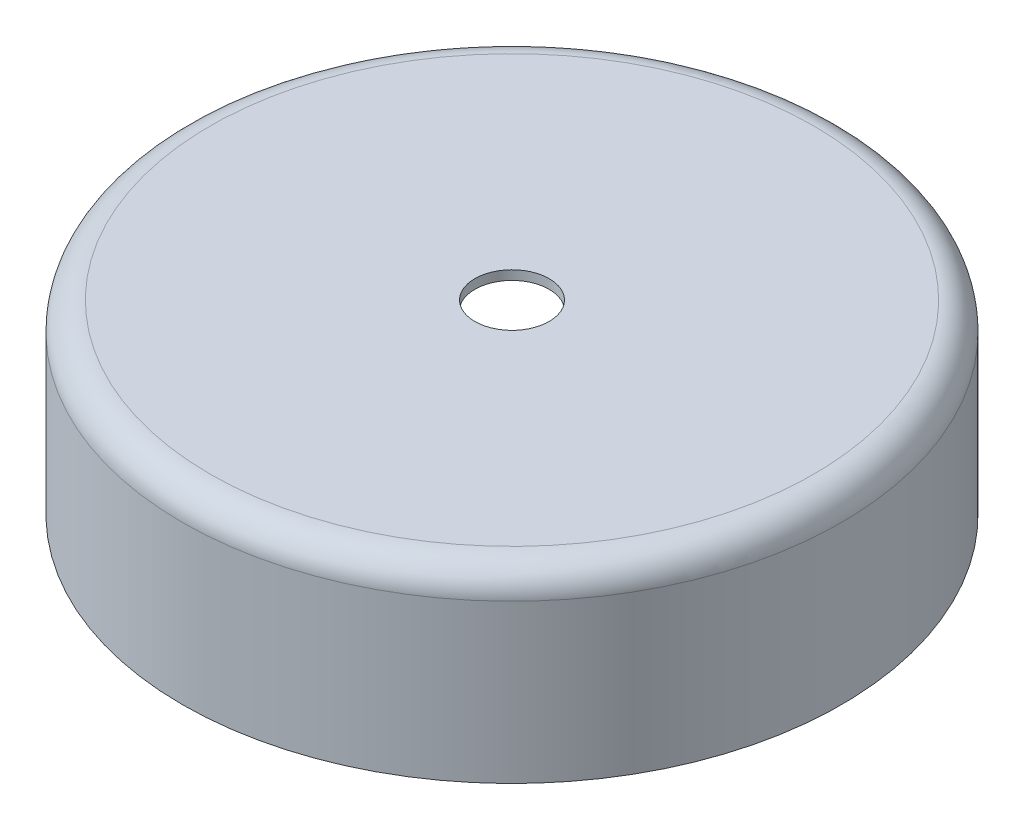
ISO-10303-21;
HEADER;
FILE_DESCRIPTION(('STEP AP214'),'2;1');
FILE_NAME('part.step','',(''),(''),'','','');
FILE_SCHEMA(('AUTOMOTIVE_DESIGN { 1 0 10303 214 1 1 1 1 }'));
ENDSEC;
DATA;
#1=APPLICATION_CONTEXT('core data for automotive mechanical design processes');
#2=APPLICATION_PROTOCOL_DEFINITION('international standard','automotive_design',2000,#1);
#3=PRODUCT_CONTEXT('',#1,'mechanical');
#4=PRODUCT('Part','Part','',(#3));
#5=PRODUCT_RELATED_PRODUCT_CATEGORY('part','',(#4));
#6=PRODUCT_DEFINITION_FORMATION('','',#4);
#7=PRODUCT_DEFINITION_CONTEXT('part definition',#1,'design');
#8=PRODUCT_DEFINITION('design','',#6,#7);
#9=PRODUCT_DEFINITION_SHAPE('','',#8);
#10=(LENGTH_UNIT() NAMED_UNIT(*) SI_UNIT(.MILLI.,.METRE.));
#11=(NAMED_UNIT(*) PLANE_ANGLE_UNIT() SI_UNIT($,.RADIAN.));
#12=(NAMED_UNIT(*) SI_UNIT($,.STERADIAN.) SOLID_ANGLE_UNIT());
#13=UNCERTAINTY_MEASURE_WITH_UNIT(LENGTH_MEASURE(1.E-05),#10,'distance_accuracy_value','');
#14=(GEOMETRIC_REPRESENTATION_CONTEXT(3) GLOBAL_UNCERTAINTY_ASSIGNED_CONTEXT((#13)) GLOBAL_UNIT_ASSIGNED_CONTEXT((#10,
#11,#12)) REPRESENTATION_CONTEXT('',''));
#15=CARTESIAN_POINT('',(0.,0.,0.));
#16=DIRECTION('',(0.,0.,1.));
#17=DIRECTION('',(1.,0.,0.));
#18=AXIS2_PLACEMENT_3D('',#15,#16,#17);
#19=CARTESIAN_POINT('',(0.,20.,0.));
#20=DIRECTION('',(0.,-1.,0.));
#21=DIRECTION('',(0.,0.,-1.));
#22=AXIS2_PLACEMENT_3D('',#19,#20,#21);
#23=CYLINDRICAL_SURFACE('',#22,35.5);
#24=CARTESIAN_POINT('',(0.,17.,0.));
#25=DIRECTION('',(0.,1.,0.));
#26=DIRECTION('',(0.,0.,1.));
#27=AXIS2_PLACEMENT_3D('',#24,#25,#26);
#28=CIRCLE('',#27,35.5);
#29=CARTESIAN_POINT('',(0.,17.,35.5));
#30=VERTEX_POINT('',#29);
#31=EDGE_CURVE('E10',#30,#30,#28,.F.);
#32=ORIENTED_EDGE('',*,*,#31,.T.);
#33=EDGE_LOOP('',(#32));
#34=FACE_BOUND('',#33,.T.);
#35=CARTESIAN_POINT('',(0.,0.,0.));
#36=DIRECTION('',(0.,1.,0.));
#37=DIRECTION('',(0.,0.,1.));
#38=AXIS2_PLACEMENT_3D('',#35,#36,#37);
#39=CIRCLE('',#38,35.5);
#40=CARTESIAN_POINT('',(0.,0.,35.5));
#41=VERTEX_POINT('',#40);
#42=EDGE_CURVE('E42',#41,#41,#39,.T.);
#43=ORIENTED_EDGE('',*,*,#42,.T.);
#44=EDGE_LOOP('',(#43));
#45=FACE_BOUND('',#44,.T.);
#46=ADVANCED_FACE('F30',(#34,#45),#23,.T.);
#47=CARTESIAN_POINT('',(0.,20.,0.));
#48=DIRECTION('',(0.,1.,0.));
#49=DIRECTION('',(0.,0.,1.));
#50=AXIS2_PLACEMENT_3D('',#47,#48,#49);
#51=PLANE('',#50);
#52=CARTESIAN_POINT('',(0.,20.,0.));
#53=DIRECTION('',(0.,1.,0.));
#54=DIRECTION('',(0.,0.,1.));
#55=AXIS2_PLACEMENT_3D('',#52,#53,#54);
#56=CIRCLE('',#55,4.);
#57=CARTESIAN_POINT('',(0.,20.,4.));
#58=VERTEX_POINT('',#57);
#59=EDGE_CURVE('E56',#58,#58,#56,.T.);
#60=ORIENTED_EDGE('',*,*,#59,.F.);
#61=EDGE_LOOP('',(#60));
#62=FACE_BOUND('',#61,.T.);
#63=CARTESIAN_POINT('',(0.,20.,0.));
#64=DIRECTION('',(0.,1.,0.));
#65=DIRECTION('',(0.,0.,1.));
#66=AXIS2_PLACEMENT_3D('',#63,#64,#65);
#67=CIRCLE('',#66,32.5);
#68=CARTESIAN_POINT('',(0.,20.,32.5));
#69=VERTEX_POINT('',#68);
#70=EDGE_CURVE('E38',#69,#69,#67,.T.);
#71=ORIENTED_EDGE('',*,*,#70,.T.);
#72=EDGE_LOOP('',(#71));
#73=FACE_BOUND('',#72,.T.);
#74=ADVANCED_FACE('F77',(#62,#73),#51,.T.);
#75=CARTESIAN_POINT('',(0.,0.,0.));
#76=DIRECTION('',(0.,1.,0.));
#77=DIRECTION('',(0.,0.,1.));
#78=AXIS2_PLACEMENT_3D('',#75,#76,#77);
#79=PLANE('',#78);
#80=CARTESIAN_POINT('',(0.,0.,0.));
#81=DIRECTION('',(0.,1.,0.));
#82=DIRECTION('',(0.,0.,1.));
#83=AXIS2_PLACEMENT_3D('',#80,#81,#82);
#84=CIRCLE('',#83,34.5);
#85=CARTESIAN_POINT('',(0.,0.,34.5));
#86=VERTEX_POINT('',#85);
#87=EDGE_CURVE('E48',#86,#86,#84,.T.);
#88=ORIENTED_EDGE('',*,*,#87,.T.);
#89=EDGE_LOOP('',(#88));
#90=FACE_BOUND('',#89,.T.);
#91=ORIENTED_EDGE('',*,*,#42,.F.);
#92=EDGE_LOOP('',(#91));
#93=FACE_BOUND('',#92,.T.);
#94=ADVANCED_FACE('F81',(#90,#93),#79,.F.);
#95=CARTESIAN_POINT('',(0.,17.,0.));
#96=DIRECTION('',(0.,1.,0.));
#97=DIRECTION('',(0.,0.,1.));
#98=AXIS2_PLACEMENT_3D('',#95,#96,#97);
#99=TOROIDAL_SURFACE('',#98,32.5,3.);
#100=ORIENTED_EDGE('',*,*,#31,.F.);
#101=EDGE_LOOP('',(#100));
#102=FACE_BOUND('',#101,.T.);
#103=ORIENTED_EDGE('',*,*,#70,.F.);
#104=EDGE_LOOP('',(#103));
#105=FACE_BOUND('',#104,.T.);
#106=ADVANCED_FACE('F32',(#102,#105),#99,.T.);
#107=CARTESIAN_POINT('',(0.,20.,0.));
#108=DIRECTION('',(0.,-1.,0.));
#109=DIRECTION('',(0.,0.,-1.));
#110=AXIS2_PLACEMENT_3D('',#107,#108,#109);
#111=CYLINDRICAL_SURFACE('',#110,34.5);
#112=CARTESIAN_POINT('',(0.,17.,0.));
#113=DIRECTION('',(0.,-1.,0.));
#114=DIRECTION('',(0.,0.,-1.));
#115=AXIS2_PLACEMENT_3D('',#112,#113,#114);
#116=CIRCLE('',#115,34.5);
#117=CARTESIAN_POINT('',(0.,17.,-34.5));
#118=VERTEX_POINT('',#117);
#119=EDGE_CURVE('E47',#118,#118,#116,.T.);
#120=ORIENTED_EDGE('',*,*,#119,.F.);
#121=EDGE_LOOP('',(#120));
#122=FACE_BOUND('',#121,.T.);
#123=ORIENTED_EDGE('',*,*,#87,.F.);
#124=EDGE_LOOP('',(#123));
#125=FACE_BOUND('',#124,.T.);
#126=ADVANCED_FACE('F90',(#122,#125),#111,.F.);
#127=CARTESIAN_POINT('',(0.,19.,0.));
#128=DIRECTION('',(0.,1.,0.));
#129=DIRECTION('',(0.,0.,1.));
#130=AXIS2_PLACEMENT_3D('',#127,#128,#129);
#131=PLANE('',#130);
#132=CARTESIAN_POINT('',(0.,19.,0.));
#133=DIRECTION('',(0.,1.,0.));
#134=DIRECTION('',(0.,0.,1.));
#135=AXIS2_PLACEMENT_3D('',#132,#133,#134);
#136=CIRCLE('',#135,4.);
#137=CARTESIAN_POINT('',(0.,19.,4.));
#138=VERTEX_POINT('',#137);
#139=EDGE_CURVE('E34',#138,#138,#136,.T.);
#140=ORIENTED_EDGE('',*,*,#139,.T.);
#141=EDGE_LOOP('',(#140));
#142=FACE_BOUND('',#141,.T.);
#143=CARTESIAN_POINT('',(0.,19.,0.));
#144=DIRECTION('',(0.,1.,0.));
#145=DIRECTION('',(0.,0.,1.));
#146=AXIS2_PLACEMENT_3D('',#143,#144,#145);
#147=CIRCLE('',#146,32.5);
#148=CARTESIAN_POINT('',(0.,19.,32.5));
#149=VERTEX_POINT('',#148);
#150=EDGE_CURVE('E51',#149,#149,#147,.T.);
#151=ORIENTED_EDGE('',*,*,#150,.F.);
#152=EDGE_LOOP('',(#151));
#153=FACE_BOUND('',#152,.T.);
#154=ADVANCED_FACE('F63',(#142,#153),#131,.F.);
#155=CARTESIAN_POINT('',(0.,17.,0.));
#156=DIRECTION('',(0.,1.,0.));
#157=DIRECTION('',(0.,0.,1.));
#158=AXIS2_PLACEMENT_3D('',#155,#156,#157);
#159=TOROIDAL_SURFACE('',#158,32.5,2.);
#160=ORIENTED_EDGE('',*,*,#119,.T.);
#161=EDGE_LOOP('',(#160));
#162=FACE_BOUND('',#161,.T.);
#163=ORIENTED_EDGE('',*,*,#150,.T.);
#164=EDGE_LOOP('',(#163));
#165=FACE_BOUND('',#164,.T.);
#166=ADVANCED_FACE('F68',(#162,#165),#159,.F.);
#167=CARTESIAN_POINT('',(0.,18.,0.));
#168=DIRECTION('',(0.,1.,0.));
#169=DIRECTION('',(0.,0.,1.));
#170=AXIS2_PLACEMENT_3D('',#167,#168,#169);
#171=CYLINDRICAL_SURFACE('',#170,4.);
#172=ORIENTED_EDGE('',*,*,#59,.T.);
#173=EDGE_LOOP('',(#172));
#174=FACE_BOUND('',#173,.T.);
#175=ORIENTED_EDGE('',*,*,#139,.F.);
#176=EDGE_LOOP('',(#175));
#177=FACE_BOUND('',#176,.T.);
#178=ADVANCED_FACE('F66',(#174,#177),#171,.F.);
#179=CLOSED_SHELL('',(#46,#74,#94,#106,#126,#154,#166,#178));
#180=MANIFOLD_SOLID_BREP('B2',#179);
#181=ADVANCED_BREP_SHAPE_REPRESENTATION('',(#18,#180),#14);
#182=SHAPE_DEFINITION_REPRESENTATION(#9,#181);
ENDSEC;
END-ISO-10303-21;
